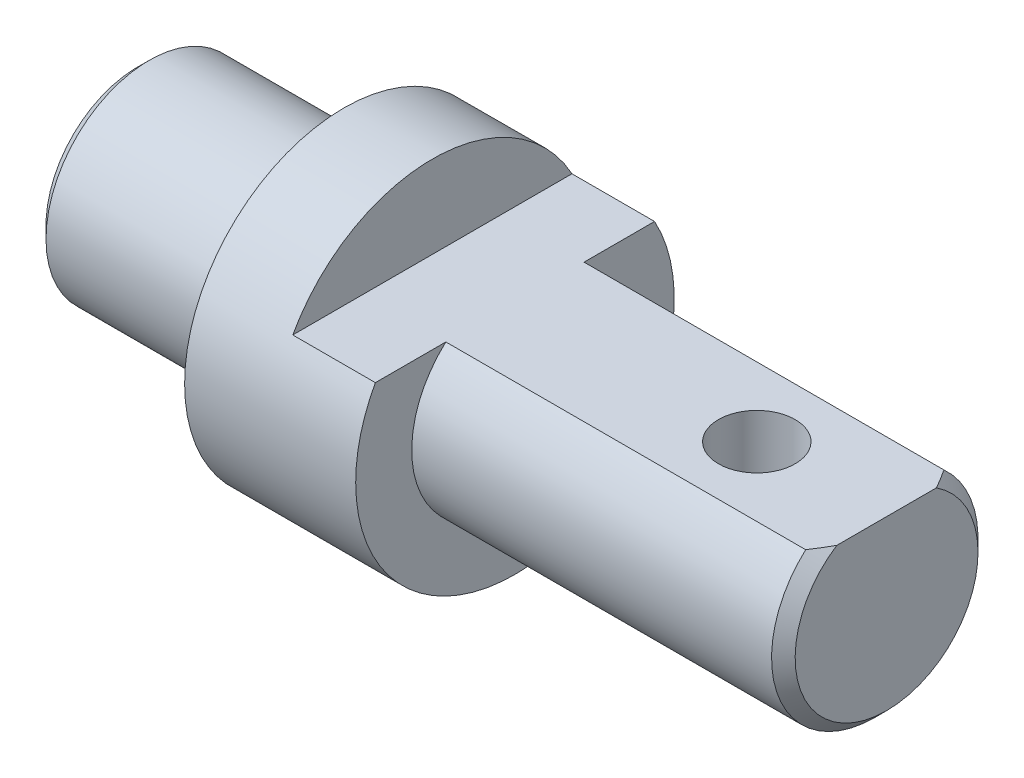
ISO-10303-21;
HEADER;
FILE_DESCRIPTION(('STEP AP214'),'2;1');
FILE_NAME('part.step','',(''),(''),'','','');
FILE_SCHEMA(('AUTOMOTIVE_DESIGN { 1 0 10303 214 1 1 1 1 }'));
ENDSEC;
DATA;
#1=APPLICATION_CONTEXT('core data for automotive mechanical design processes');
#2=APPLICATION_PROTOCOL_DEFINITION('international standard','automotive_design',2000,#1);
#3=PRODUCT_CONTEXT('',#1,'mechanical');
#4=PRODUCT('Part','Part','',(#3));
#5=PRODUCT_RELATED_PRODUCT_CATEGORY('part','',(#4));
#6=PRODUCT_DEFINITION_FORMATION('','',#4);
#7=PRODUCT_DEFINITION_CONTEXT('part definition',#1,'design');
#8=PRODUCT_DEFINITION('design','',#6,#7);
#9=PRODUCT_DEFINITION_SHAPE('','',#8);
#10=(LENGTH_UNIT() NAMED_UNIT(*) SI_UNIT(.MILLI.,.METRE.));
#11=(NAMED_UNIT(*) PLANE_ANGLE_UNIT() SI_UNIT($,.RADIAN.));
#12=(NAMED_UNIT(*) SI_UNIT($,.STERADIAN.) SOLID_ANGLE_UNIT());
#13=UNCERTAINTY_MEASURE_WITH_UNIT(LENGTH_MEASURE(1.E-05),#10,'distance_accuracy_value','');
#14=(GEOMETRIC_REPRESENTATION_CONTEXT(3) GLOBAL_UNCERTAINTY_ASSIGNED_CONTEXT((#13)) GLOBAL_UNIT_ASSIGNED_CONTEXT((#10,
#11,#12)) REPRESENTATION_CONTEXT('',''));
#15=CARTESIAN_POINT('',(0.,0.,0.));
#16=DIRECTION('',(0.,0.,1.));
#17=DIRECTION('',(1.,0.,0.));
#18=AXIS2_PLACEMENT_3D('',#15,#16,#17);
#19=CARTESIAN_POINT('',(63.5,0.,0.));
#20=DIRECTION('',(-1.,0.,0.));
#21=DIRECTION('',(0.,0.,1.));
#22=AXIS2_PLACEMENT_3D('',#19,#20,#21);
#23=PLANE('',#22);
#24=DIRECTION('',(0.,0.,-1.));
#25=VECTOR('',#24,1.);
#26=CARTESIAN_POINT('',(63.5,13.,23.6643191323985));
#27=LINE('',#26,#25);
#28=CARTESIAN_POINT('',(63.5,13.,8.44097150806702));
#29=VERTEX_POINT('',#28);
#30=CARTESIAN_POINT('',(63.5,13.,-8.44097150806701));
#31=VERTEX_POINT('',#30);
#32=EDGE_CURVE('E111',#29,#31,#27,.T.);
#33=ORIENTED_EDGE('',*,*,#32,.F.);
#34=CARTESIAN_POINT('',(63.5,0.,0.));
#35=DIRECTION('',(-1.,0.,0.));
#36=DIRECTION('',(0.,0.,1.));
#37=AXIS2_PLACEMENT_3D('',#34,#35,#36);
#38=CIRCLE('',#37,15.5);
#39=EDGE_CURVE('E61',#29,#31,#38,.F.);
#40=ORIENTED_EDGE('',*,*,#39,.T.);
#41=EDGE_LOOP('',(#33,#40));
#42=FACE_BOUND('',#41,.T.);
#43=ADVANCED_FACE('F45',(#42),#23,.F.);
#44=CARTESIAN_POINT('',(-63.5,0.,0.));
#45=DIRECTION('',(-1.,0.,0.));
#46=DIRECTION('',(0.,0.,1.));
#47=AXIS2_PLACEMENT_3D('',#44,#45,#46);
#48=CYLINDRICAL_SURFACE('',#47,17.5);
#49=CARTESIAN_POINT('',(41.5,-16.2480768276741,6.499999954));
#50=CARTESIAN_POINT('',(41.6756083098974,-16.2480761293203,6.50000073173772));
#51=CARTESIAN_POINT('',(41.8512060361976,-16.250931397393,6.49287769844811));
#52=CARTESIAN_POINT('',(42.2011325896941,-16.262256988032,6.46445925887452));
#53=CARTESIAN_POINT('',(42.3754609576895,-16.2707292495927,6.44315895856695));
#54=CARTESIAN_POINT('',(42.7214125673614,-16.2930064232796,6.38661574837273));
#55=CARTESIAN_POINT('',(42.8930369311042,-16.3068090594042,6.35137878910598));
#56=CARTESIAN_POINT('',(43.2325115480867,-16.3393094799776,6.26729563881822));
#57=CARTESIAN_POINT('',(43.4003602851745,-16.3580091941081,6.21844408250979));
#58=CARTESIAN_POINT('',(43.7306360901693,-16.3996636974956,6.10774213943437));
#59=CARTESIAN_POINT('',(43.8930769540381,-16.4226064928002,6.04592832883525));
#60=CARTESIAN_POINT('',(44.2120817712342,-16.4721141778404,5.90971268295664));
#61=CARTESIAN_POINT('',(44.3686436241279,-16.498680346712,5.8353063999939));
#62=CARTESIAN_POINT('',(44.6749351130602,-16.5546832699976,5.67447872641274));
#63=CARTESIAN_POINT('',(44.8246644685206,-16.5841201421423,5.58805684295934));
#64=CARTESIAN_POINT('',(45.1164743739947,-16.645075015509,5.40378509446017));
#65=CARTESIAN_POINT('',(45.25855454575,-16.6765931194783,5.30593466502032));
#66=CARTESIAN_POINT('',(45.540450688891,-16.742330400518,5.09481403862454));
#67=CARTESIAN_POINT('',(45.6798846641117,-16.7766073624168,4.98105148210633));
#68=CARTESIAN_POINT('',(45.9487433887502,-16.845605897106,4.74246514179842));
#69=CARTESIAN_POINT('',(46.0781711237616,-16.8803273336449,4.6176446814294));
#70=CARTESIAN_POINT('',(46.3263732491473,-16.9493261858684,4.35757357522188));
#71=CARTESIAN_POINT('',(46.445141728228,-16.9836033462663,4.22231721833403));
#72=CARTESIAN_POINT('',(46.671161127332,-17.0507849376183,3.94226569488038));
#73=CARTESIAN_POINT('',(46.7784162597879,-17.0836898679225,3.79747404852772));
#74=CARTESIAN_POINT('',(46.9841572881947,-17.1483562440508,3.49409951858152));
#75=CARTESIAN_POINT('',(47.0822245143496,-17.1800415034691,3.33521597269558));
#76=CARTESIAN_POINT('',(47.264519575349,-17.2401357742693,3.00918283072594));
#77=CARTESIAN_POINT('',(47.3487526178081,-17.2685460172625,2.84203637602429));
#78=CARTESIAN_POINT('',(47.5026860973521,-17.3212877789083,2.50056579834134));
#79=CARTESIAN_POINT('',(47.5723874106498,-17.3456195434617,2.32624210888178));
#80=CARTESIAN_POINT('',(47.6965931412655,-17.3894907367118,1.97167760015125));
#81=CARTESIAN_POINT('',(47.7510983825029,-17.4090304252244,1.79143710227758));
#82=CARTESIAN_POINT('',(47.8423730379337,-17.4420172105111,1.43416962259101));
#83=CARTESIAN_POINT('',(47.8797961556355,-17.4556874012525,1.25733013327751));
#84=CARTESIAN_POINT('',(47.9398118720391,-17.4777114081354,0.900828254144659));
#85=CARTESIAN_POINT('',(47.9624052171582,-17.4860654918483,0.721166006867466));
#86=CARTESIAN_POINT('',(47.9925200139892,-17.4972175179253,0.360457710456735));
#87=CARTESIAN_POINT('',(48.0000453921654,-17.5000169077495,0.179412034169071));
#88=CARTESIAN_POINT('',(47.9999541069945,-17.4999829403966,-0.182672401439926));
#89=CARTESIAN_POINT('',(47.9923378915269,-17.497149749828,-0.363711160807457));
#90=CARTESIAN_POINT('',(47.9627881876178,-17.4862076247285,-0.715540145970266));
#91=CARTESIAN_POINT('',(47.9415714865625,-17.4783628813755,-0.886399383566868));
#92=CARTESIAN_POINT('',(47.8857100936801,-17.4578526425032,-1.2256718443583));
#93=CARTESIAN_POINT('',(47.8510609867321,-17.445185561946,-1.3940842443951));
#94=CARTESIAN_POINT('',(47.7686677914416,-17.4153588519919,-1.72720446008973));
#95=CARTESIAN_POINT('',(47.7209279563146,-17.3982006818452,-1.8919134602186));
#96=CARTESIAN_POINT('',(47.6127434370938,-17.3598120984305,-2.21668089464741));
#97=CARTESIAN_POINT('',(47.5522939400803,-17.3385801427606,-2.37673754097514));
#98=CARTESIAN_POINT('',(47.4182532052784,-17.2922442859842,-2.69337137650592));
#99=CARTESIAN_POINT('',(47.3444891060622,-17.2670901315358,-2.84986797716449));
#100=CARTESIAN_POINT('',(47.1849482335031,-17.2137440776343,-3.1561350403108));
#101=CARTESIAN_POINT('',(47.0991673637431,-17.1855511430452,-3.30590318603399));
#102=CARTESIAN_POINT('',(46.9162043580411,-17.126814216502,-3.59783373249056));
#103=CARTESIAN_POINT('',(46.8190212510253,-17.096270024379,-3.73999548392044));
#104=CARTESIAN_POINT('',(46.6138795705094,-17.0335618232161,-4.01594276082503));
#105=CARTESIAN_POINT('',(46.5059205073914,-17.0013977406077,-4.14972790524913));
#106=CARTESIAN_POINT('',(46.2733359436715,-16.9343329916352,-4.41568153478851));
#107=CARTESIAN_POINT('',(46.1481081426404,-16.899381525117,-4.54731102894572));
#108=CARTESIAN_POINT('',(45.8871245779477,-16.8294701112064,-4.79959045201265));
#109=CARTESIAN_POINT('',(45.7513720030873,-16.7945101695571,-4.92024368262349));
#110=CARTESIAN_POINT('',(45.4700178438496,-16.7255025603578,-5.1499473088013));
#111=CARTESIAN_POINT('',(45.3244103212857,-16.6914554604108,-5.25899060503517));
#112=CARTESIAN_POINT('',(45.0243293595864,-16.6252667265664,-5.46462924630201));
#113=CARTESIAN_POINT('',(44.8698594066206,-16.5931243533944,-5.56122943814518));
#114=CARTESIAN_POINT('',(44.5494426136543,-16.5309972132576,-5.74330836767821));
#115=CARTESIAN_POINT('',(44.3833184358853,-16.5010751737125,-5.82849695658757));
#116=CARTESIAN_POINT('',(44.0438693478394,-16.4451593550756,-5.98444638432156));
#117=CARTESIAN_POINT('',(43.8705473452212,-16.4191640090488,-6.05521298215483));
#118=CARTESIAN_POINT('',(43.5178962923101,-16.3719695478527,-6.18168041654547));
#119=CARTESIAN_POINT('',(43.3385686691214,-16.3507693023875,-6.23738480415689));
#120=CARTESIAN_POINT('',(42.97523147212,-16.3139099975867,-6.33316515329508));
#121=CARTESIAN_POINT('',(42.7912222132804,-16.298250566525,-6.37324216326117));
#122=CARTESIAN_POINT('',(42.4301004786614,-16.2737339647083,-6.43557618257796));
#123=CARTESIAN_POINT('',(42.253156305426,-16.2645535060888,-6.45868290685316));
#124=CARTESIAN_POINT('',(41.897765545025,-16.2519749604665,-6.49026981151578));
#125=CARTESIAN_POINT('',(41.7193190299313,-16.24857659765,-6.49875068957569));
#126=CARTESIAN_POINT('',(41.3623571369797,-16.2476797003861,-6.50099263914295));
#127=CARTESIAN_POINT('',(41.1838417812469,-16.250179935571,-6.49475678036273));
#128=CARTESIAN_POINT('',(40.8281074944593,-16.2609911696136,-6.46764089037236));
#129=CARTESIAN_POINT('',(40.6508885392385,-16.2693020598752,-6.44676113284447));
#130=CARTESIAN_POINT('',(40.3072909846521,-16.2909339312765,-6.39189280097401));
#131=CARTESIAN_POINT('',(40.1407914174143,-16.3040040581061,-6.35855871229144));
#132=CARTESIAN_POINT('',(39.8112597134867,-16.3347764752045,-6.27908368265119));
#133=CARTESIAN_POINT('',(39.6482287300122,-16.3524802808122,-6.23293855183391));
#134=CARTESIAN_POINT('',(39.3267506584957,-16.3919970140884,-6.12825907159512));
#135=CARTESIAN_POINT('',(39.1683026258374,-16.4138090879163,-6.06972729623573));
#136=CARTESIAN_POINT('',(38.8568254721865,-16.460943425648,-5.9407117953541));
#137=CARTESIAN_POINT('',(38.7037984485511,-16.486267029917,-5.8702235036765));
#138=CARTESIAN_POINT('',(38.3985692911481,-16.5407225283383,-5.71502441245967));
#139=CARTESIAN_POINT('',(38.2466028851405,-16.5699599723581,-5.62988707992558));
#140=CARTESIAN_POINT('',(37.9502603928906,-16.6306826666861,-5.44789827435125));
#141=CARTESIAN_POINT('',(37.8058869400291,-16.6621686880326,-5.35104277516633));
#142=CARTESIAN_POINT('',(37.5255384780539,-16.7265575307001,-5.14624075392566));
#143=CARTESIAN_POINT('',(37.3895646849093,-16.7594605559878,-5.0382926320529));
#144=CARTESIAN_POINT('',(37.1267597955361,-16.8258450509953,-4.81194834403794));
#145=CARTESIAN_POINT('',(36.9999289896068,-16.85932653904,-4.69355184641424));
#146=CARTESIAN_POINT('',(36.7485070625882,-16.9281176417733,-4.43928332472347));
#147=CARTESIAN_POINT('',(36.6245467703161,-16.963411323425,-4.30278225341203));
#148=CARTESIAN_POINT('',(36.3885656731615,-17.0327344207723,-4.0196016925809));
#149=CARTESIAN_POINT('',(36.2765409918854,-17.0667642445846,-3.87292553339023));
#150=CARTESIAN_POINT('',(36.0651189652515,-17.1326540963455,-3.57017765976085));
#151=CARTESIAN_POINT('',(35.9657269233974,-17.1645132103879,-3.41410203945008));
#152=CARTESIAN_POINT('',(35.7804261061147,-17.2251520108516,-3.09365686670772));
#153=CARTESIAN_POINT('',(35.6945115838035,-17.2539330081222,-2.92929088905384));
#154=CARTESIAN_POINT('',(35.537103973182,-17.3075321625677,-2.59385365113258));
#155=CARTESIAN_POINT('',(35.4655633722385,-17.3323633171899,-2.42280679122238));
#156=CARTESIAN_POINT('',(35.3372276483046,-17.3774610742233,-2.07475818635037));
#157=CARTESIAN_POINT('',(35.2804264670152,-17.3977295515625,-1.89775892188694));
#158=CARTESIAN_POINT('',(35.1821070262959,-17.4331198328652,-1.53909010125588));
#159=CARTESIAN_POINT('',(35.1405861433332,-17.4482425202952,-1.35742135254554));
#160=CARTESIAN_POINT('',(35.0732594120636,-17.4728935991623,-0.990823125217848));
#161=CARTESIAN_POINT('',(35.047452681175,-17.482422304783,-0.805893830328696));
#162=CARTESIAN_POINT('',(35.0128609388357,-17.4952203348257,-0.44495708630679));
#163=CARTESIAN_POINT('',(35.0031847287828,-17.498817251245,-0.26904610273964));
#164=CARTESIAN_POINT('',(34.9981466002637,-17.5006883111099,0.0830074214553831));
#165=CARTESIAN_POINT('',(35.0027842735194,-17.4989626063739,0.25914995533545));
#166=CARTESIAN_POINT('',(35.0263247700697,-17.4902359354201,0.610324256614927));
#167=CARTESIAN_POINT('',(35.0452259263633,-17.4832355856606,0.785356151406483));
#168=CARTESIAN_POINT('',(35.0971009047745,-17.4641500348592,1.13303856572697));
#169=CARTESIAN_POINT('',(35.1300747221288,-17.4520648355386,1.30568908606196));
#170=CARTESIAN_POINT('',(35.2088248200077,-17.4234776875018,1.64330229477822));
#171=CARTESIAN_POINT('',(35.2542775518412,-17.407087762836,1.80835015101377));
#172=CARTESIAN_POINT('',(35.3579051918739,-17.3701751939918,2.13398180341699));
#173=CARTESIAN_POINT('',(35.4160843250889,-17.349651177523,2.29456409706741));
#174=CARTESIAN_POINT('',(35.5446743202262,-17.3049781639951,2.61019534846863));
#175=CARTESIAN_POINT('',(35.6150824958319,-17.2808299632075,2.76524551244765));
#176=CARTESIAN_POINT('',(35.7676092075095,-17.229485226067,3.06897642166496));
#177=CARTESIAN_POINT('',(35.8497322669487,-17.2022875131042,3.21765467760143));
#178=CARTESIAN_POINT('',(36.1200833046658,-17.1147167923991,3.66482349777666));
#179=CARTESIAN_POINT('',(36.327025047663,-17.050270596655,3.95147387926452));
#180=CARTESIAN_POINT('',(36.7840176357673,-16.9172356309221,4.48704025868639));
#181=CARTESIAN_POINT('',(37.0340837471704,-16.8486453995241,4.73594283481646));
#182=CARTESIAN_POINT('',(37.4439113400973,-16.7461374245878,5.08256406754986));
#183=CARTESIAN_POINT('',(37.5903427962341,-16.7111852791607,5.19605001064035));
#184=CARTESIAN_POINT('',(37.8926136310599,-16.6430640221271,5.4102713855759));
#185=CARTESIAN_POINT('',(38.0484495026157,-16.6098942544464,5.51101152776664));
#186=CARTESIAN_POINT('',(38.3686706535577,-16.54631646759,5.69905941706887));
#187=CARTESIAN_POINT('',(38.5330603752219,-16.5159099064045,5.78636008958687));
#188=CARTESIAN_POINT('',(38.8691905805207,-16.4588500888939,5.94672148585621));
#189=CARTESIAN_POINT('',(39.0409278733182,-16.4321952244619,6.01978831591353));
#190=CARTESIAN_POINT('',(39.39695122329,-16.382632392071,6.15342389495448));
#191=CARTESIAN_POINT('',(39.5814664759764,-16.3598942364959,6.2134468292944));
#192=CARTESIAN_POINT('',(39.9557236863168,-16.3202381740039,6.31687422149022));
#193=CARTESIAN_POINT('',(40.1454658394026,-16.3033204850318,6.3602780570582));
#194=CARTESIAN_POINT('',(40.5284363500482,-16.2759786694949,6.4299239192789));
#195=CARTESIAN_POINT('',(40.7216628029803,-16.2655510997006,6.45617504639707));
#196=CARTESIAN_POINT('',(41.1099306514293,-16.2516009320479,6.49121170746495));
#197=CARTESIAN_POINT('',(41.3049718526269,-16.2480776032561,6.4999990902553));
#198=CARTESIAN_POINT('',(41.5,-16.2480768276741,6.499999954));
#199=B_SPLINE_CURVE_WITH_KNOTS('',3,(#49,#50,#51,#52,#53,#54,#55,#56,#57,#58,#59,#60,#61,#62,
#63,#64,#65,#66,#67,#68,#69,#70,#71,#72,#73,#74,#75,#76,#77,#78,#79,#80,#81,#82,#83,#84,#85,#86,
#87,#88,#89,#90,#91,#92,#93,#94,#95,#96,#97,#98,#99,#100,#101,#102,#103,#104,#105,#106,#107,
#108,#109,#110,#111,#112,#113,#114,#115,#116,#117,#118,#119,#120,#121,#122,#123,#124,#125,#126,
#127,#128,#129,#130,#131,#132,#133,#134,#135,#136,#137,#138,#139,#140,#141,#142,#143,#144,#145,
#146,#147,#148,#149,#150,#151,#152,#153,#154,#155,#156,#157,#158,#159,#160,#161,#162,#163,#164,
#165,#166,#167,#168,#169,#170,#171,#172,#173,#174,#175,#176,#177,#178,#179,#180,#181,#182,#183,
#184,#185,#186,#187,#188,#189,#190,#191,#192,#193,#194,#195,#196,#197,#198),.UNSPECIFIED.,.T.,
.F.,(4,2,2,2,2,2,2,2,2,2,2,2,2,2,2,2,2,2,2,2,2,2,2,2,2,2,2,2,2,2,2,2,2,2,2,2,2,2,2,2,2,2,2,2,2,
2,2,2,2,2,2,2,2,2,2,2,2,2,2,2,2,2,2,2,2,2,2,2,2,2,2,2,2,2,4),(0.,0.526640116593783,
1.05346212486069,1.58005943515022,2.10686456288831,2.63220271612934,3.15772680845337,
3.68327246217188,4.20884408073083,4.75779958172781,5.30659065187844,5.85568420789541,
6.4045761752246,6.97201168039643,7.53923309327547,8.10642029477681,8.6735767378416,
9.21669907641273,9.75979407626576,10.3027475360695,10.8456849358647,11.3621281836303,
11.8787413261484,12.3951868180335,12.9118282318841,13.435735359139,13.959821518551,
14.4839523443093,15.0081069954042,15.5625145936013,16.1167548686567,16.6713321316216,
17.2256927194224,17.792203137807,18.3584868913165,18.9246370216068,19.490749162399,
20.0261106711186,20.5614466416697,21.0966709582416,21.6318852721838,22.1422200001907,
22.6527218305188,23.1631176777209,23.673708884128,24.2030109771233,24.7324954477229,
25.2620563898966,25.7916341387779,26.3541760798065,26.9165347604833,27.4791287592405,
28.0414822091454,28.6019450727489,29.1621772047987,29.7223131035313,30.2824175394587,
30.8104046896295,31.3383767800438,31.8662871748868,32.3941973910357,32.9095370124367,
33.425047980905,33.9404458515346,34.4560432696996,35.5291446886667,36.6026267750064,
37.1676401498259,37.7324441042432,38.2975443646123,38.862401660996,39.4476316317748,
40.0328835138459,40.6178246345839,41.2027038258456),.UNSPECIFIED.);
#200=CARTESIAN_POINT('',(41.5,-16.2480768276741,6.499999954));
#201=VERTEX_POINT('',#200);
#202=EDGE_CURVE('E156',#201,#201,#199,.T.);
#203=ORIENTED_EDGE('',*,*,#202,.T.);
#204=EDGE_LOOP('',(#203));
#205=FACE_BOUND('',#204,.T.);
#206=DIRECTION('',(-1.,0.,0.));
#207=VECTOR('',#206,1.);
#208=CARTESIAN_POINT('',(-63.5,13.,-11.71537451386));
#209=LINE('',#208,#207);
#210=CARTESIAN_POINT('',(0.5,13.,-11.71537451386));
#211=VERTEX_POINT('',#210);
#212=CARTESIAN_POINT('',(61.5,13.,-11.71537451386));
#213=VERTEX_POINT('',#212);
#214=EDGE_CURVE('E131',#211,#213,#209,.F.);
#215=ORIENTED_EDGE('',*,*,#214,.T.);
#216=CARTESIAN_POINT('',(61.5,0.,0.));
#217=DIRECTION('',(-1.,0.,0.));
#218=DIRECTION('',(0.,0.,1.));
#219=AXIS2_PLACEMENT_3D('',#216,#217,#218);
#220=CIRCLE('',#219,17.5);
#221=CARTESIAN_POINT('',(61.5,13.,11.71537451386));
#222=VERTEX_POINT('',#221);
#223=EDGE_CURVE('E102',#213,#222,#220,.T.);
#224=ORIENTED_EDGE('',*,*,#223,.T.);
#225=DIRECTION('',(-1.,0.,0.));
#226=VECTOR('',#225,1.);
#227=CARTESIAN_POINT('',(-63.5,13.,11.71537451386));
#228=LINE('',#227,#226);
#229=CARTESIAN_POINT('',(0.5,13.,11.71537451386));
#230=VERTEX_POINT('',#229);
#231=EDGE_CURVE('E127',#222,#230,#228,.T.);
#232=ORIENTED_EDGE('',*,*,#231,.T.);
#233=CARTESIAN_POINT('',(0.5,0.,0.));
#234=DIRECTION('',(-1.,0.,0.));
#235=DIRECTION('',(0.,0.,1.));
#236=AXIS2_PLACEMENT_3D('',#233,#234,#235);
#237=CIRCLE('',#236,17.5);
#238=EDGE_CURVE('E103',#211,#230,#237,.T.);
#239=ORIENTED_EDGE('',*,*,#238,.F.);
#240=EDGE_LOOP('',(#215,#224,#232,#239));
#241=FACE_BOUND('',#240,.T.);
#242=ADVANCED_FACE('F167',(#205,#241),#48,.T.);
#243=CARTESIAN_POINT('',(0.499999999999997,27.,0.));
#244=DIRECTION('',(-1.,0.,0.));
#245=DIRECTION('',(0.,0.,1.));
#246=AXIS2_PLACEMENT_3D('',#243,#244,#245);
#247=PLANE('',#246);
#248=CARTESIAN_POINT('',(0.5,0.,0.));
#249=DIRECTION('',(-1.,0.,0.));
#250=DIRECTION('',(0.,0.,1.));
#251=AXIS2_PLACEMENT_3D('',#248,#249,#250);
#252=CIRCLE('',#251,27.);
#253=CARTESIAN_POINT('',(0.5,13.,-23.6643191323985));
#254=VERTEX_POINT('',#253);
#255=CARTESIAN_POINT('',(0.5,13.,23.6643191323985));
#256=VERTEX_POINT('',#255);
#257=EDGE_CURVE('E117',#254,#256,#252,.T.);
#258=ORIENTED_EDGE('',*,*,#257,.F.);
#259=DIRECTION('',(0.,0.,1.));
#260=VECTOR('',#259,1.);
#261=CARTESIAN_POINT('',(0.499999999999997,13.,0.));
#262=LINE('',#261,#260);
#263=EDGE_CURVE('E128',#254,#211,#262,.T.);
#264=ORIENTED_EDGE('',*,*,#263,.T.);
#265=ORIENTED_EDGE('',*,*,#238,.T.);
#266=EDGE_CURVE('E121',#230,#256,#262,.T.);
#267=ORIENTED_EDGE('',*,*,#266,.T.);
#268=EDGE_LOOP('',(#258,#264,#265,#267));
#269=FACE_BOUND('',#268,.T.);
#270=ADVANCED_FACE('F210',(#269),#247,.F.);
#271=CARTESIAN_POINT('',(-63.5,0.,0.));
#272=DIRECTION('',(-1.,0.,0.));
#273=DIRECTION('',(0.,0.,1.));
#274=AXIS2_PLACEMENT_3D('',#271,#272,#273);
#275=CYLINDRICAL_SURFACE('',#274,27.);
#276=ORIENTED_EDGE('',*,*,#257,.T.);
#277=DIRECTION('',(1.,0.,0.));
#278=VECTOR('',#277,1.);
#279=CARTESIAN_POINT('',(-13.5,13.,23.6643191323985));
#280=LINE('',#279,#278);
#281=CARTESIAN_POINT('',(-13.5,13.,23.6643191323985));
#282=VERTEX_POINT('',#281);
#283=EDGE_CURVE('E107',#282,#256,#280,.T.);
#284=ORIENTED_EDGE('',*,*,#283,.F.);
#285=CARTESIAN_POINT('',(-13.5,0.,0.));
#286=DIRECTION('',(1.,0.,0.));
#287=DIRECTION('',(0.,0.,-1.));
#288=AXIS2_PLACEMENT_3D('',#285,#286,#287);
#289=CIRCLE('',#288,27.);
#290=CARTESIAN_POINT('',(-13.5,13.,-23.6643191323985));
#291=VERTEX_POINT('',#290);
#292=EDGE_CURVE('E93',#291,#282,#289,.T.);
#293=ORIENTED_EDGE('',*,*,#292,.F.);
#294=DIRECTION('',(1.,0.,0.));
#295=VECTOR('',#294,1.);
#296=CARTESIAN_POINT('',(-13.5,13.,-23.6643191323985));
#297=LINE('',#296,#295);
#298=EDGE_CURVE('E109',#291,#254,#297,.T.);
#299=ORIENTED_EDGE('',*,*,#298,.T.);
#300=EDGE_LOOP('',(#276,#284,#293,#299));
#301=FACE_BOUND('',#300,.T.);
#302=CARTESIAN_POINT('',(-28.5,0.,0.));
#303=DIRECTION('',(-1.,0.,0.));
#304=DIRECTION('',(0.,0.,1.));
#305=AXIS2_PLACEMENT_3D('',#302,#303,#304);
#306=CIRCLE('',#305,27.);
#307=CARTESIAN_POINT('',(-28.5,0.,27.));
#308=VERTEX_POINT('',#307);
#309=EDGE_CURVE('E147',#308,#308,#306,.T.);
#310=ORIENTED_EDGE('',*,*,#309,.F.);
#311=EDGE_LOOP('',(#310));
#312=FACE_BOUND('',#311,.T.);
#313=ADVANCED_FACE('F114',(#301,#312),#275,.T.);
#314=CARTESIAN_POINT('',(-28.5,17.5,0.));
#315=DIRECTION('',(1.,0.,0.));
#316=DIRECTION('',(0.,0.,-1.));
#317=AXIS2_PLACEMENT_3D('',#314,#315,#316);
#318=PLANE('',#317);
#319=ORIENTED_EDGE('',*,*,#309,.T.);
#320=EDGE_LOOP('',(#319));
#321=FACE_BOUND('',#320,.T.);
#322=CARTESIAN_POINT('',(-28.5,0.,0.));
#323=DIRECTION('',(-1.,0.,0.));
#324=DIRECTION('',(0.,0.,1.));
#325=AXIS2_PLACEMENT_3D('',#322,#323,#324);
#326=CIRCLE('',#325,16.5);
#327=CARTESIAN_POINT('',(-28.5,0.,16.5));
#328=VERTEX_POINT('',#327);
#329=EDGE_CURVE('E135',#328,#328,#326,.T.);
#330=ORIENTED_EDGE('',*,*,#329,.F.);
#331=EDGE_LOOP('',(#330));
#332=FACE_BOUND('',#331,.T.);
#333=ADVANCED_FACE('F236',(#321,#332),#318,.F.);
#334=CARTESIAN_POINT('',(-31.5,17.5,0.));
#335=DIRECTION('',(1.,0.,0.));
#336=DIRECTION('',(0.,0.,-1.));
#337=AXIS2_PLACEMENT_3D('',#334,#335,#336);
#338=PLANE('',#337);
#339=CARTESIAN_POINT('',(-31.5,0.,0.));
#340=DIRECTION('',(-1.,0.,0.));
#341=DIRECTION('',(0.,0.,1.));
#342=AXIS2_PLACEMENT_3D('',#339,#340,#341);
#343=CIRCLE('',#342,16.5);
#344=CARTESIAN_POINT('',(-31.5,0.,16.5));
#345=VERTEX_POINT('',#344);
#346=EDGE_CURVE('E139',#345,#345,#343,.T.);
#347=ORIENTED_EDGE('',*,*,#346,.T.);
#348=EDGE_LOOP('',(#347));
#349=FACE_BOUND('',#348,.T.);
#350=CARTESIAN_POINT('',(-31.5,0.,0.));
#351=DIRECTION('',(-1.,0.,0.));
#352=DIRECTION('',(0.,0.,1.));
#353=AXIS2_PLACEMENT_3D('',#350,#351,#352);
#354=CIRCLE('',#353,17.5);
#355=CARTESIAN_POINT('',(-31.5,0.,17.5));
#356=VERTEX_POINT('',#355);
#357=EDGE_CURVE('E143',#356,#356,#354,.T.);
#358=ORIENTED_EDGE('',*,*,#357,.F.);
#359=EDGE_LOOP('',(#358));
#360=FACE_BOUND('',#359,.T.);
#361=ADVANCED_FACE('F234',(#349,#360),#338,.T.);
#362=CARTESIAN_POINT('',(-63.5,0.,0.));
#363=DIRECTION('',(-1.,0.,0.));
#364=DIRECTION('',(0.,0.,1.));
#365=AXIS2_PLACEMENT_3D('',#362,#363,#364);
#366=CYLINDRICAL_SURFACE('',#365,16.5);
#367=ORIENTED_EDGE('',*,*,#329,.T.);
#368=EDGE_LOOP('',(#367));
#369=FACE_BOUND('',#368,.T.);
#370=ORIENTED_EDGE('',*,*,#346,.F.);
#371=EDGE_LOOP('',(#370));
#372=FACE_BOUND('',#371,.T.);
#373=ADVANCED_FACE('F184',(#369,#372),#366,.T.);
#374=CARTESIAN_POINT('',(-63.5,0.,0.));
#375=DIRECTION('',(1.,0.,0.));
#376=DIRECTION('',(0.,0.,-1.));
#377=AXIS2_PLACEMENT_3D('',#374,#375,#376);
#378=PLANE('',#377);
#379=CARTESIAN_POINT('',(-63.5,0.,0.));
#380=DIRECTION('',(1.,0.,0.));
#381=DIRECTION('',(0.,0.,-1.));
#382=AXIS2_PLACEMENT_3D('',#379,#380,#381);
#383=CIRCLE('',#382,15.5);
#384=CARTESIAN_POINT('',(-63.5,0.,-15.5));
#385=VERTEX_POINT('',#384);
#386=EDGE_CURVE('E55',#385,#385,#383,.F.);
#387=ORIENTED_EDGE('',*,*,#386,.T.);
#388=EDGE_LOOP('',(#387));
#389=FACE_BOUND('',#388,.T.);
#390=ADVANCED_FACE('F221',(#389),#378,.F.);
#391=CARTESIAN_POINT('',(-63.5,0.,0.));
#392=DIRECTION('',(-1.,0.,0.));
#393=DIRECTION('',(0.,0.,1.));
#394=AXIS2_PLACEMENT_3D('',#391,#392,#393);
#395=CYLINDRICAL_SURFACE('',#394,17.5);
#396=CARTESIAN_POINT('',(-61.5,0.,0.));
#397=DIRECTION('',(1.,0.,0.));
#398=DIRECTION('',(0.,0.,-1.));
#399=AXIS2_PLACEMENT_3D('',#396,#397,#398);
#400=CIRCLE('',#399,17.5);
#401=CARTESIAN_POINT('',(-61.5,0.,-17.5));
#402=VERTEX_POINT('',#401);
#403=EDGE_CURVE('E11',#402,#402,#400,.T.);
#404=ORIENTED_EDGE('',*,*,#403,.T.);
#405=EDGE_LOOP('',(#404));
#406=FACE_BOUND('',#405,.T.);
#407=ORIENTED_EDGE('',*,*,#357,.T.);
#408=EDGE_LOOP('',(#407));
#409=FACE_BOUND('',#408,.T.);
#410=ADVANCED_FACE('F182',(#406,#409),#395,.T.);
#411=CARTESIAN_POINT('',(-13.5,13.,23.6643191323985));
#412=DIRECTION('',(0.,-1.,0.));
#413=DIRECTION('',(0.,0.,-1.));
#414=AXIS2_PLACEMENT_3D('',#411,#412,#413);
#415=PLANE('',#414);
#416=CARTESIAN_POINT('',(41.5,13.,0.));
#417=DIRECTION('',(0.,1.,0.));
#418=DIRECTION('',(0.,0.,1.));
#419=AXIS2_PLACEMENT_3D('',#416,#417,#418);
#420=CIRCLE('',#419,6.499999954);
#421=CARTESIAN_POINT('',(41.5,13.,6.499999954));
#422=VERTEX_POINT('',#421);
#423=EDGE_CURVE('E165',#422,#422,#420,.T.);
#424=ORIENTED_EDGE('',*,*,#423,.F.);
#425=EDGE_LOOP('',(#424));
#426=FACE_BOUND('',#425,.T.);
#427=ORIENTED_EDGE('',*,*,#231,.F.);
#428=CARTESIAN_POINT('',(61.5,13.,11.71537451386));
#429=CARTESIAN_POINT('',(61.6779477306041,13.,11.4495266059892));
#430=CARTESIAN_POINT('',(61.8536290590264,13.,11.1821423664869));
#431=CARTESIAN_POINT('',(62.19958053673,13.,10.6440936477942));
#432=CARTESIAN_POINT('',(62.3698534233142,13.,10.3734309269005));
#433=CARTESIAN_POINT('',(62.7043104826629,13.,9.82831856405617));
#434=CARTESIAN_POINT('',(62.8684940666695,13.,9.55386855942513));
#435=CARTESIAN_POINT('',(63.1898145234918,13.,9.00069017609811));
#436=CARTESIAN_POINT('',(63.3469477221688,13.,8.72195966597949));
#437=CARTESIAN_POINT('',(63.5,13.,8.44097150806702));
#438=B_SPLINE_CURVE_WITH_KNOTS('',3,(#428,#429,#430,#431,#432,#433,#434,#435,#436,#437),
.UNSPECIFIED.,.F.,.F.,(4,2,2,2,4),(0.,0.959732284173769,1.91897083086501,2.8783018831858,
3.83812719531569),.UNSPECIFIED.);
#439=EDGE_CURVE('E68',#222,#29,#438,.T.);
#440=ORIENTED_EDGE('',*,*,#439,.T.);
#441=ORIENTED_EDGE('',*,*,#32,.T.);
#442=CARTESIAN_POINT('',(63.5,13.,-8.44097150806702));
#443=CARTESIAN_POINT('',(63.3469477221688,13.,-8.72195966597949));
#444=CARTESIAN_POINT('',(63.1898145234918,13.,-9.0006901760981));
#445=CARTESIAN_POINT('',(62.8684940666695,13.,-9.55386855942513));
#446=CARTESIAN_POINT('',(62.7043104826629,13.,-9.82831856405616));
#447=CARTESIAN_POINT('',(62.3698534233142,13.,-10.3734309269005));
#448=CARTESIAN_POINT('',(62.19958053673,13.,-10.6440936477942));
#449=CARTESIAN_POINT('',(61.8536290590264,13.,-11.1821423664869));
#450=CARTESIAN_POINT('',(61.6779477306041,13.,-11.4495266059892));
#451=CARTESIAN_POINT('',(61.5,13.,-11.71537451386));
#452=B_SPLINE_CURVE_WITH_KNOTS('',3,(#442,#443,#444,#445,#446,#447,#448,#449,#450,#451),
.UNSPECIFIED.,.F.,.F.,(4,2,2,2,4),(0.,0.959825312129881,1.91915636445068,2.87839491114192,
3.83812719531569),.UNSPECIFIED.);
#453=EDGE_CURVE('E187',#31,#213,#452,.T.);
#454=ORIENTED_EDGE('',*,*,#453,.T.);
#455=ORIENTED_EDGE('',*,*,#214,.F.);
#456=ORIENTED_EDGE('',*,*,#263,.F.);
#457=ORIENTED_EDGE('',*,*,#298,.F.);
#458=DIRECTION('',(0.,0.,-1.));
#459=VECTOR('',#458,1.);
#460=CARTESIAN_POINT('',(-13.5,13.,23.6643191323985));
#461=LINE('',#460,#459);
#462=EDGE_CURVE('E96',#282,#291,#461,.T.);
#463=ORIENTED_EDGE('',*,*,#462,.F.);
#464=ORIENTED_EDGE('',*,*,#283,.T.);
#465=ORIENTED_EDGE('',*,*,#266,.F.);
#466=EDGE_LOOP('',(#427,#440,#441,#454,#455,#456,#457,#463,#464,#465));
#467=FACE_BOUND('',#466,.T.);
#468=ADVANCED_FACE('F105',(#426,#467),#415,.F.);
#469=CARTESIAN_POINT('',(-13.5,0.,0.));
#470=DIRECTION('',(1.,0.,0.));
#471=DIRECTION('',(0.,0.,-1.));
#472=AXIS2_PLACEMENT_3D('',#469,#470,#471);
#473=PLANE('',#472);
#474=ORIENTED_EDGE('',*,*,#462,.T.);
#475=ORIENTED_EDGE('',*,*,#292,.T.);
#476=EDGE_LOOP('',(#474,#475));
#477=FACE_BOUND('',#476,.T.);
#478=ADVANCED_FACE('F95',(#477),#473,.T.);
#479=CARTESIAN_POINT('',(41.5,13.,0.));
#480=DIRECTION('',(0.,1.,0.));
#481=DIRECTION('',(0.,0.,1.));
#482=AXIS2_PLACEMENT_3D('',#479,#480,#481);
#483=CYLINDRICAL_SURFACE('',#482,6.499999954);
#484=ORIENTED_EDGE('',*,*,#423,.T.);
#485=EDGE_LOOP('',(#484));
#486=FACE_BOUND('',#485,.T.);
#487=ORIENTED_EDGE('',*,*,#202,.F.);
#488=EDGE_LOOP('',(#487));
#489=FACE_BOUND('',#488,.T.);
#490=ADVANCED_FACE('F171',(#486,#489),#483,.F.);
#491=CARTESIAN_POINT('',(61.5,0.,0.));
#492=DIRECTION('',(-1.,0.,0.));
#493=DIRECTION('',(0.,0.,1.));
#494=AXIS2_PLACEMENT_3D('',#491,#492,#493);
#495=CONICAL_SURFACE('',#494,17.5,0.785398163397452);
#496=ORIENTED_EDGE('',*,*,#453,.F.);
#497=ORIENTED_EDGE('',*,*,#39,.F.);
#498=ORIENTED_EDGE('',*,*,#439,.F.);
#499=ORIENTED_EDGE('',*,*,#223,.F.);
#500=EDGE_LOOP('',(#496,#497,#498,#499));
#501=FACE_BOUND('',#500,.T.);
#502=ADVANCED_FACE('F175',(#501),#495,.T.);
#503=CARTESIAN_POINT('',(-63.5,0.,0.));
#504=DIRECTION('',(1.,0.,0.));
#505=DIRECTION('',(0.,0.,-1.));
#506=AXIS2_PLACEMENT_3D('',#503,#504,#505);
#507=CONICAL_SURFACE('',#506,15.5,0.785398163397447);
#508=ORIENTED_EDGE('',*,*,#403,.F.);
#509=EDGE_LOOP('',(#508));
#510=FACE_BOUND('',#509,.T.);
#511=ORIENTED_EDGE('',*,*,#386,.F.);
#512=EDGE_LOOP('',(#511));
#513=FACE_BOUND('',#512,.T.);
#514=ADVANCED_FACE('F48',(#510,#513),#507,.T.);
#515=CLOSED_SHELL('',(#43,#242,#270,#313,#333,#361,#373,#390,#410,#468,#478,#490,#502,#514));
#516=MANIFOLD_SOLID_BREP('B2',#515);
#517=ADVANCED_BREP_SHAPE_REPRESENTATION('',(#18,#516),#14);
#518=SHAPE_DEFINITION_REPRESENTATION(#9,#517);
ENDSEC;
END-ISO-10303-21;
